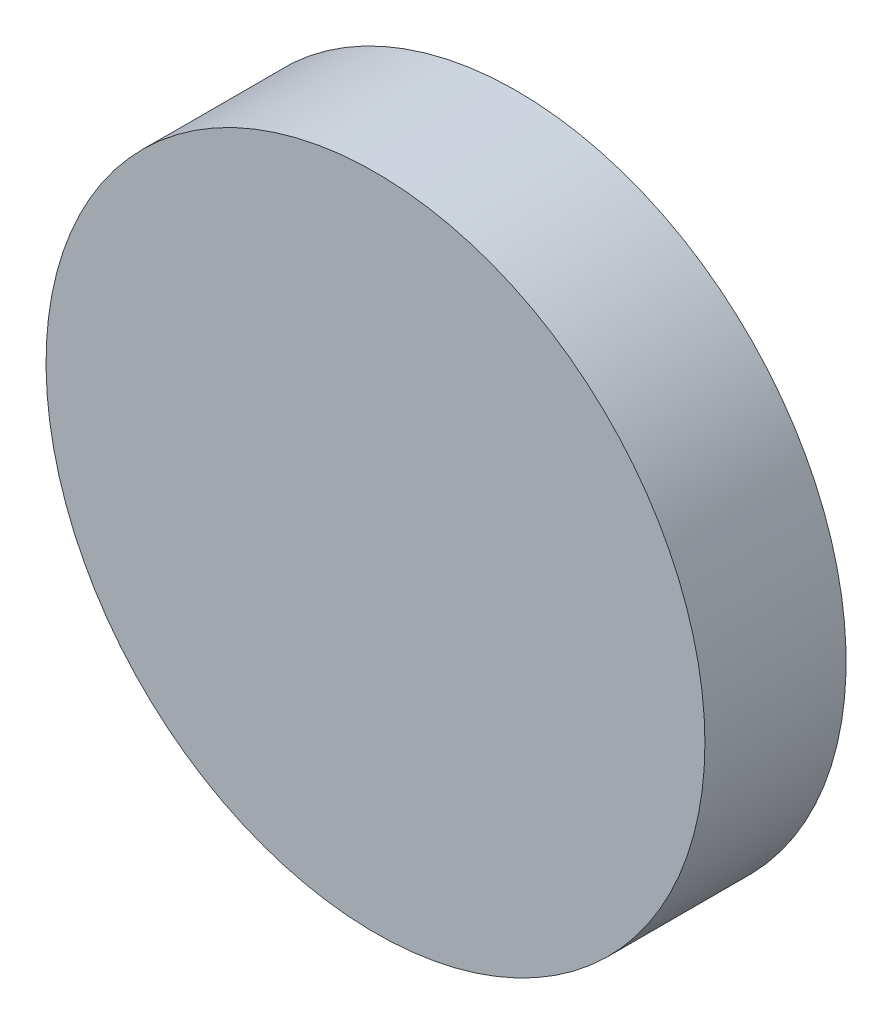
ISO-10303-21;
HEADER;
FILE_DESCRIPTION(('STEP AP214'),'2;1');
FILE_NAME('part.step','',(''),(''),'','','');
FILE_SCHEMA(('AUTOMOTIVE_DESIGN { 1 0 10303 214 1 1 1 1 }'));
ENDSEC;
DATA;
#1=APPLICATION_CONTEXT('core data for automotive mechanical design processes');
#2=APPLICATION_PROTOCOL_DEFINITION('international standard','automotive_design',2000,#1);
#3=PRODUCT_CONTEXT('',#1,'mechanical');
#4=PRODUCT('Part','Part','',(#3));
#5=PRODUCT_RELATED_PRODUCT_CATEGORY('part','',(#4));
#6=PRODUCT_DEFINITION_FORMATION('','',#4);
#7=PRODUCT_DEFINITION_CONTEXT('part definition',#1,'design');
#8=PRODUCT_DEFINITION('design','',#6,#7);
#9=PRODUCT_DEFINITION_SHAPE('','',#8);
#10=(LENGTH_UNIT() NAMED_UNIT(*) SI_UNIT(.MILLI.,.METRE.));
#11=(NAMED_UNIT(*) PLANE_ANGLE_UNIT() SI_UNIT($,.RADIAN.));
#12=(NAMED_UNIT(*) SI_UNIT($,.STERADIAN.) SOLID_ANGLE_UNIT());
#13=UNCERTAINTY_MEASURE_WITH_UNIT(LENGTH_MEASURE(1.E-05),#10,'distance_accuracy_value','');
#14=(GEOMETRIC_REPRESENTATION_CONTEXT(3) GLOBAL_UNCERTAINTY_ASSIGNED_CONTEXT((#13)) GLOBAL_UNIT_ASSIGNED_CONTEXT((#10,
#11,#12)) REPRESENTATION_CONTEXT('',''));
#15=CARTESIAN_POINT('',(0.,0.,0.));
#16=DIRECTION('',(0.,0.,1.));
#17=DIRECTION('',(1.,0.,0.));
#18=AXIS2_PLACEMENT_3D('',#15,#16,#17);
#19=CARTESIAN_POINT('',(0.,0.,2.));
#20=DIRECTION('',(0.,0.,1.));
#21=DIRECTION('',(1.,0.,0.));
#22=AXIS2_PLACEMENT_3D('',#19,#20,#21);
#23=PLANE('',#22);
#24=CARTESIAN_POINT('',(0.,0.,2.));
#25=DIRECTION('',(0.,0.,1.));
#26=DIRECTION('',(1.,0.,0.));
#27=AXIS2_PLACEMENT_3D('',#24,#25,#26);
#28=CIRCLE('',#27,10.85);
#29=CARTESIAN_POINT('',(10.85,0.,2.));
#30=VERTEX_POINT('',#29);
#31=EDGE_CURVE('E11',#30,#30,#28,.T.);
#32=ORIENTED_EDGE('',*,*,#31,.T.);
#33=EDGE_LOOP('',(#32));
#34=FACE_BOUND('',#33,.T.);
#35=DIRECTION('',(-0.681998360062494,0.731353701619174,0.));
#36=VECTOR('',#35,1.);
#37=CARTESIAN_POINT('',(0.,0.,2.));
#38=LINE('',#37,#36);
#39=CARTESIAN_POINT('',(-8.62727925479055,9.25162432548256,2.));
#40=VERTEX_POINT('',#39);
#41=CARTESIAN_POINT('',(-9.54797704087492,10.2389518226684,2.));
#42=VERTEX_POINT('',#41);
#43=EDGE_CURVE('E92',#40,#42,#38,.T.);
#44=ORIENTED_EDGE('',*,*,#43,.F.);
#45=CARTESIAN_POINT('',(0.,0.,2.));
#46=DIRECTION('',(0.,0.,-1.));
#47=DIRECTION('',(-1.,0.,0.));
#48=AXIS2_PLACEMENT_3D('',#45,#46,#47);
#49=CIRCLE('',#48,12.65);
#50=CARTESIAN_POINT('',(-8.62727925479062,-9.25162432548249,2.));
#51=VERTEX_POINT('',#50);
#52=EDGE_CURVE('E103',#40,#51,#49,.T.);
#53=ORIENTED_EDGE('',*,*,#52,.T.);
#54=DIRECTION('',(-0.6819983600625,-0.731353701619169,0.));
#55=VECTOR('',#54,1.);
#56=CARTESIAN_POINT('',(0.,0.,2.));
#57=LINE('',#56,#55);
#58=CARTESIAN_POINT('',(-9.547977040875,-10.2389518226684,2.));
#59=VERTEX_POINT('',#58);
#60=EDGE_CURVE('E107',#51,#59,#57,.T.);
#61=ORIENTED_EDGE('',*,*,#60,.T.);
#62=CARTESIAN_POINT('',(0.,0.,2.));
#63=DIRECTION('',(0.,0.,1.));
#64=DIRECTION('',(1.,0.,0.));
#65=AXIS2_PLACEMENT_3D('',#62,#63,#64);
#66=CIRCLE('',#65,14.);
#67=EDGE_CURVE('E112',#42,#59,#66,.T.);
#68=ORIENTED_EDGE('',*,*,#67,.F.);
#69=EDGE_LOOP('',(#44,#53,#61,#68));
#70=FACE_BOUND('',#69,.T.);
#71=ADVANCED_FACE('F35',(#34,#70),#23,.F.);
#72=CARTESIAN_POINT('',(0.,0.,2.));
#73=DIRECTION('',(0.,0.,-1.));
#74=DIRECTION('',(-1.,0.,0.));
#75=AXIS2_PLACEMENT_3D('',#72,#73,#74);
#76=CYLINDRICAL_SURFACE('',#75,10.85);
#77=ORIENTED_EDGE('',*,*,#31,.F.);
#78=EDGE_LOOP('',(#77));
#79=FACE_BOUND('',#78,.T.);
#80=CARTESIAN_POINT('',(0.,0.,0.));
#81=DIRECTION('',(0.,0.,1.));
#82=DIRECTION('',(1.,0.,0.));
#83=AXIS2_PLACEMENT_3D('',#80,#81,#82);
#84=CIRCLE('',#83,10.85);
#85=CARTESIAN_POINT('',(10.85,0.,0.));
#86=VERTEX_POINT('',#85);
#87=EDGE_CURVE('E39',#86,#86,#84,.T.);
#88=ORIENTED_EDGE('',*,*,#87,.T.);
#89=EDGE_LOOP('',(#88));
#90=FACE_BOUND('',#89,.T.);
#91=ADVANCED_FACE('F37',(#79,#90),#76,.T.);
#92=CARTESIAN_POINT('',(0.,0.,0.));
#93=DIRECTION('',(0.,0.,1.));
#94=DIRECTION('',(1.,0.,0.));
#95=AXIS2_PLACEMENT_3D('',#92,#93,#94);
#96=PLANE('',#95);
#97=ORIENTED_EDGE('',*,*,#87,.F.);
#98=EDGE_LOOP('',(#97));
#99=FACE_BOUND('',#98,.T.);
#100=ADVANCED_FACE('F133',(#99),#96,.F.);
#101=CARTESIAN_POINT('',(0.,0.,3.));
#102=DIRECTION('',(0.,0.,-1.));
#103=DIRECTION('',(-1.,0.,0.));
#104=AXIS2_PLACEMENT_3D('',#101,#102,#103);
#105=CYLINDRICAL_SURFACE('',#104,14.);
#106=CARTESIAN_POINT('',(0.,0.,3.));
#107=DIRECTION('',(0.,0.,1.));
#108=DIRECTION('',(1.,0.,0.));
#109=AXIS2_PLACEMENT_3D('',#106,#107,#108);
#110=CIRCLE('',#109,14.);
#111=CARTESIAN_POINT('',(14.,0.,3.));
#112=VERTEX_POINT('',#111);
#113=EDGE_CURVE('E113',#112,#112,#110,.T.);
#114=ORIENTED_EDGE('',*,*,#113,.F.);
#115=EDGE_LOOP('',(#114));
#116=FACE_BOUND('',#115,.T.);
#117=ORIENTED_EDGE('',*,*,#67,.T.);
#118=DIRECTION('',(0.,0.,1.));
#119=VECTOR('',#118,1.);
#120=CARTESIAN_POINT('',(-9.547977040875,-10.2389518226684,-3.));
#121=LINE('',#120,#119);
#122=CARTESIAN_POINT('',(-9.547977040875,-10.2389518226684,-3.));
#123=VERTEX_POINT('',#122);
#124=EDGE_CURVE('E50',#123,#59,#121,.T.);
#125=ORIENTED_EDGE('',*,*,#124,.F.);
#126=CARTESIAN_POINT('',(0.,0.,-3.));
#127=DIRECTION('',(0.,0.,-1.));
#128=DIRECTION('',(-1.,0.,0.));
#129=AXIS2_PLACEMENT_3D('',#126,#127,#128);
#130=CIRCLE('',#129,14.);
#131=CARTESIAN_POINT('',(-9.54797704087492,10.2389518226684,-3.));
#132=VERTEX_POINT('',#131);
#133=EDGE_CURVE('E84',#132,#123,#130,.T.);
#134=ORIENTED_EDGE('',*,*,#133,.F.);
#135=DIRECTION('',(0.,0.,1.));
#136=VECTOR('',#135,1.);
#137=CARTESIAN_POINT('',(-9.54797704087492,10.2389518226684,-3.));
#138=LINE('',#137,#136);
#139=EDGE_CURVE('E89',#132,#42,#138,.T.);
#140=ORIENTED_EDGE('',*,*,#139,.T.);
#141=EDGE_LOOP('',(#117,#125,#134,#140));
#142=FACE_BOUND('',#141,.T.);
#143=ADVANCED_FACE('F97',(#116,#142),#105,.T.);
#144=CARTESIAN_POINT('',(0.,0.,3.));
#145=DIRECTION('',(0.,0.,1.));
#146=DIRECTION('',(1.,0.,0.));
#147=AXIS2_PLACEMENT_3D('',#144,#145,#146);
#148=PLANE('',#147);
#149=ORIENTED_EDGE('',*,*,#113,.T.);
#150=EDGE_LOOP('',(#149));
#151=FACE_BOUND('',#150,.T.);
#152=ADVANCED_FACE('F137',(#151),#148,.T.);
#153=CARTESIAN_POINT('',(0.,0.,-3.));
#154=DIRECTION('',(0.,0.,1.));
#155=DIRECTION('',(1.,0.,0.));
#156=AXIS2_PLACEMENT_3D('',#153,#154,#155);
#157=CYLINDRICAL_SURFACE('',#156,12.65);
#158=ORIENTED_EDGE('',*,*,#52,.F.);
#159=DIRECTION('',(0.,0.,1.));
#160=VECTOR('',#159,1.);
#161=CARTESIAN_POINT('',(-8.62727925479055,9.25162432548256,-3.));
#162=LINE('',#161,#160);
#163=CARTESIAN_POINT('',(-8.62727925479055,9.25162432548256,-3.));
#164=VERTEX_POINT('',#163);
#165=EDGE_CURVE('E74',#164,#40,#162,.T.);
#166=ORIENTED_EDGE('',*,*,#165,.F.);
#167=CARTESIAN_POINT('',(0.,0.,-3.));
#168=DIRECTION('',(0.,0.,-1.));
#169=DIRECTION('',(-1.,0.,0.));
#170=AXIS2_PLACEMENT_3D('',#167,#168,#169);
#171=CIRCLE('',#170,12.65);
#172=CARTESIAN_POINT('',(-8.62727925479062,-9.25162432548249,-3.));
#173=VERTEX_POINT('',#172);
#174=EDGE_CURVE('E85',#164,#173,#171,.T.);
#175=ORIENTED_EDGE('',*,*,#174,.T.);
#176=DIRECTION('',(0.,0.,1.));
#177=VECTOR('',#176,1.);
#178=CARTESIAN_POINT('',(-8.62727925479062,-9.25162432548249,-3.));
#179=LINE('',#178,#177);
#180=EDGE_CURVE('E56',#173,#51,#179,.T.);
#181=ORIENTED_EDGE('',*,*,#180,.T.);
#182=EDGE_LOOP('',(#158,#166,#175,#181));
#183=FACE_BOUND('',#182,.T.);
#184=ADVANCED_FACE('F125',(#183),#157,.F.);
#185=CARTESIAN_POINT('',(0.,0.,-3.));
#186=DIRECTION('',(0.731353701619174,0.681998360062494,0.));
#187=DIRECTION('',(-0.681998360062494,0.731353701619174,0.));
#188=AXIS2_PLACEMENT_3D('',#185,#186,#187);
#189=PLANE('',#188);
#190=ORIENTED_EDGE('',*,*,#43,.T.);
#191=ORIENTED_EDGE('',*,*,#139,.F.);
#192=DIRECTION('',(-0.681998360062494,0.731353701619174,0.));
#193=VECTOR('',#192,1.);
#194=CARTESIAN_POINT('',(0.,0.,-3.));
#195=LINE('',#194,#193);
#196=EDGE_CURVE('E79',#164,#132,#195,.T.);
#197=ORIENTED_EDGE('',*,*,#196,.F.);
#198=ORIENTED_EDGE('',*,*,#165,.T.);
#199=EDGE_LOOP('',(#190,#191,#197,#198));
#200=FACE_BOUND('',#199,.T.);
#201=ADVANCED_FACE('F90',(#200),#189,.F.);
#202=CARTESIAN_POINT('',(0.,0.,-3.));
#203=DIRECTION('',(-0.731353701619169,0.6819983600625,0.));
#204=DIRECTION('',(-0.6819983600625,-0.731353701619169,0.));
#205=AXIS2_PLACEMENT_3D('',#202,#203,#204);
#206=PLANE('',#205);
#207=ORIENTED_EDGE('',*,*,#60,.F.);
#208=ORIENTED_EDGE('',*,*,#180,.F.);
#209=DIRECTION('',(-0.6819983600625,-0.731353701619169,0.));
#210=VECTOR('',#209,1.);
#211=CARTESIAN_POINT('',(0.,0.,-3.));
#212=LINE('',#211,#210);
#213=EDGE_CURVE('E98',#173,#123,#212,.T.);
#214=ORIENTED_EDGE('',*,*,#213,.T.);
#215=ORIENTED_EDGE('',*,*,#124,.T.);
#216=EDGE_LOOP('',(#207,#208,#214,#215));
#217=FACE_BOUND('',#216,.T.);
#218=ADVANCED_FACE('F117',(#217),#206,.T.);
#219=CARTESIAN_POINT('',(0.,0.,-3.));
#220=DIRECTION('',(0.,0.,-1.));
#221=DIRECTION('',(-1.,0.,0.));
#222=AXIS2_PLACEMENT_3D('',#219,#220,#221);
#223=PLANE('',#222);
#224=ORIENTED_EDGE('',*,*,#174,.F.);
#225=ORIENTED_EDGE('',*,*,#196,.T.);
#226=ORIENTED_EDGE('',*,*,#133,.T.);
#227=ORIENTED_EDGE('',*,*,#213,.F.);
#228=EDGE_LOOP('',(#224,#225,#226,#227));
#229=FACE_BOUND('',#228,.T.);
#230=ADVANCED_FACE('F81',(#229),#223,.T.);
#231=CLOSED_SHELL('',(#71,#91,#100,#143,#152,#184,#201,#218,#230));
#232=MANIFOLD_SOLID_BREP('B2',#231);
#233=ADVANCED_BREP_SHAPE_REPRESENTATION('',(#18,#232),#14);
#234=SHAPE_DEFINITION_REPRESENTATION(#9,#233);
ENDSEC;
END-ISO-10303-21;
